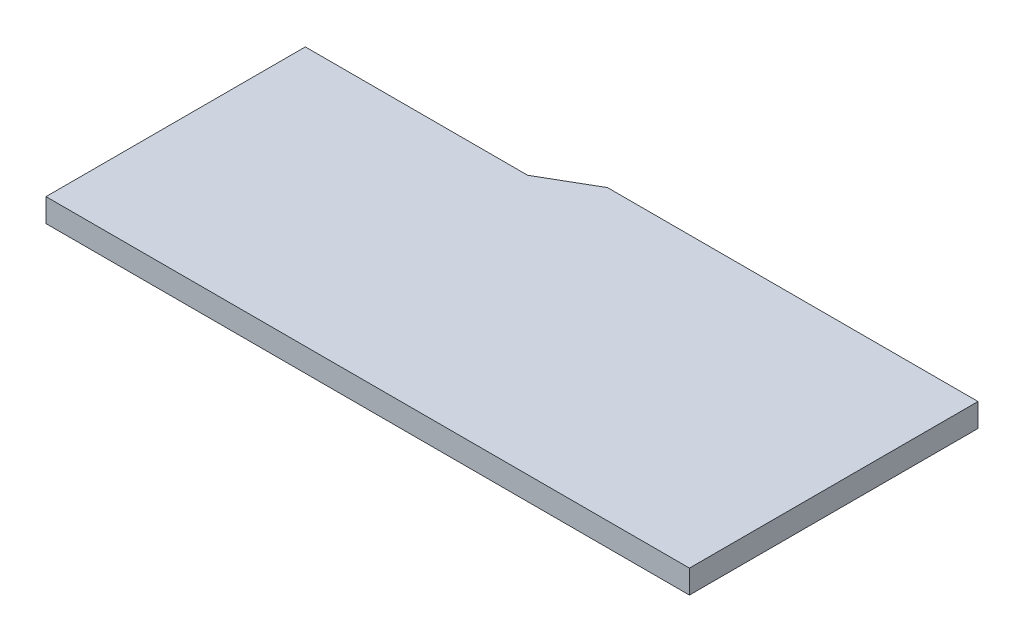
ISO-10303-21;
HEADER;
FILE_DESCRIPTION(('STEP AP214'),'2;1');
FILE_NAME('part.step','',(''),(''),'','','');
FILE_SCHEMA(('AUTOMOTIVE_DESIGN { 1 0 10303 214 1 1 1 1 }'));
ENDSEC;
DATA;
#1=APPLICATION_CONTEXT('core data for automotive mechanical design processes');
#2=APPLICATION_PROTOCOL_DEFINITION('international standard','automotive_design',2000,#1);
#3=PRODUCT_CONTEXT('',#1,'mechanical');
#4=PRODUCT('Part','Part','',(#3));
#5=PRODUCT_RELATED_PRODUCT_CATEGORY('part','',(#4));
#6=PRODUCT_DEFINITION_FORMATION('','',#4);
#7=PRODUCT_DEFINITION_CONTEXT('part definition',#1,'design');
#8=PRODUCT_DEFINITION('design','',#6,#7);
#9=PRODUCT_DEFINITION_SHAPE('','',#8);
#10=(LENGTH_UNIT() NAMED_UNIT(*) SI_UNIT(.MILLI.,.METRE.));
#11=(NAMED_UNIT(*) PLANE_ANGLE_UNIT() SI_UNIT($,.RADIAN.));
#12=(NAMED_UNIT(*) SI_UNIT($,.STERADIAN.) SOLID_ANGLE_UNIT());
#13=UNCERTAINTY_MEASURE_WITH_UNIT(LENGTH_MEASURE(1.E-05),#10,'distance_accuracy_value','');
#14=(GEOMETRIC_REPRESENTATION_CONTEXT(3) GLOBAL_UNCERTAINTY_ASSIGNED_CONTEXT((#13)) GLOBAL_UNIT_ASSIGNED_CONTEXT((#10,
#11,#12)) REPRESENTATION_CONTEXT('',''));
#15=CARTESIAN_POINT('',(0.,0.,0.));
#16=DIRECTION('',(0.,0.,1.));
#17=DIRECTION('',(1.,0.,0.));
#18=AXIS2_PLACEMENT_3D('',#15,#16,#17);
#19=CARTESIAN_POINT('',(-50.9807621135329,12.,-133.));
#20=DIRECTION('',(0.,0.,1.));
#21=DIRECTION('',(1.,0.,0.));
#22=AXIS2_PLACEMENT_3D('',#19,#20,#21);
#23=PLANE('',#22);
#24=DIRECTION('',(-1.,0.,0.));
#25=VECTOR('',#24,1.);
#26=CARTESIAN_POINT('',(-50.9807621135329,0.,-133.));
#27=LINE('',#26,#25);
#28=CARTESIAN_POINT('',(-50.9807621135329,0.,-133.));
#29=VERTEX_POINT('',#28);
#30=CARTESIAN_POINT('',(-165.,0.,-133.));
#31=VERTEX_POINT('',#30);
#32=EDGE_CURVE('E117',#29,#31,#27,.T.);
#33=ORIENTED_EDGE('',*,*,#32,.T.);
#34=DIRECTION('',(0.,-1.,0.));
#35=VECTOR('',#34,1.);
#36=CARTESIAN_POINT('',(-165.,12.,-133.));
#37=LINE('',#36,#35);
#38=CARTESIAN_POINT('',(-165.,12.,-133.));
#39=VERTEX_POINT('',#38);
#40=EDGE_CURVE('E11',#39,#31,#37,.T.);
#41=ORIENTED_EDGE('',*,*,#40,.F.);
#42=DIRECTION('',(-1.,0.,0.));
#43=VECTOR('',#42,1.);
#44=CARTESIAN_POINT('',(-50.9807621135329,12.,-133.));
#45=LINE('',#44,#43);
#46=CARTESIAN_POINT('',(-50.9807621135329,12.,-133.));
#47=VERTEX_POINT('',#46);
#48=EDGE_CURVE('E127',#47,#39,#45,.T.);
#49=ORIENTED_EDGE('',*,*,#48,.F.);
#50=DIRECTION('',(0.,-1.,0.));
#51=VECTOR('',#50,1.);
#52=CARTESIAN_POINT('',(-50.9807621135329,12.,-133.));
#53=LINE('',#52,#51);
#54=EDGE_CURVE('E113',#47,#29,#53,.T.);
#55=ORIENTED_EDGE('',*,*,#54,.T.);
#56=EDGE_LOOP('',(#33,#41,#49,#55));
#57=FACE_BOUND('',#56,.T.);
#58=ADVANCED_FACE('F33',(#57),#23,.F.);
#59=CARTESIAN_POINT('',(-165.,12.,-133.));
#60=DIRECTION('',(1.,0.,0.));
#61=DIRECTION('',(0.,0.,-1.));
#62=AXIS2_PLACEMENT_3D('',#59,#60,#61);
#63=PLANE('',#62);
#64=DIRECTION('',(0.,0.,1.));
#65=VECTOR('',#64,1.);
#66=CARTESIAN_POINT('',(-165.,0.,-133.));
#67=LINE('',#66,#65);
#68=CARTESIAN_POINT('',(-165.,0.,0.));
#69=VERTEX_POINT('',#68);
#70=EDGE_CURVE('E120',#31,#69,#67,.T.);
#71=ORIENTED_EDGE('',*,*,#70,.T.);
#72=DIRECTION('',(0.,-1.,0.));
#73=VECTOR('',#72,1.);
#74=CARTESIAN_POINT('',(-165.,12.,0.));
#75=LINE('',#74,#73);
#76=CARTESIAN_POINT('',(-165.,12.,0.));
#77=VERTEX_POINT('',#76);
#78=EDGE_CURVE('E41',#77,#69,#75,.T.);
#79=ORIENTED_EDGE('',*,*,#78,.F.);
#80=DIRECTION('',(0.,0.,1.));
#81=VECTOR('',#80,1.);
#82=CARTESIAN_POINT('',(-165.,12.,-133.));
#83=LINE('',#82,#81);
#84=EDGE_CURVE('E86',#39,#77,#83,.T.);
#85=ORIENTED_EDGE('',*,*,#84,.F.);
#86=ORIENTED_EDGE('',*,*,#40,.T.);
#87=EDGE_LOOP('',(#71,#79,#85,#86));
#88=FACE_BOUND('',#87,.T.);
#89=ADVANCED_FACE('F151',(#88),#63,.F.);
#90=CARTESIAN_POINT('',(-165.,12.,0.));
#91=DIRECTION('',(0.,0.,-1.));
#92=DIRECTION('',(-1.,0.,0.));
#93=AXIS2_PLACEMENT_3D('',#90,#91,#92);
#94=PLANE('',#93);
#95=DIRECTION('',(1.,0.,0.));
#96=VECTOR('',#95,1.);
#97=CARTESIAN_POINT('',(-165.,0.,0.));
#98=LINE('',#97,#96);
#99=CARTESIAN_POINT('',(165.,0.,0.));
#100=VERTEX_POINT('',#99);
#101=EDGE_CURVE('E122',#69,#100,#98,.T.);
#102=ORIENTED_EDGE('',*,*,#101,.T.);
#103=DIRECTION('',(0.,-1.,0.));
#104=VECTOR('',#103,1.);
#105=CARTESIAN_POINT('',(165.,12.,0.));
#106=LINE('',#105,#104);
#107=CARTESIAN_POINT('',(165.,12.,0.));
#108=VERTEX_POINT('',#107);
#109=EDGE_CURVE('E108',#108,#100,#106,.T.);
#110=ORIENTED_EDGE('',*,*,#109,.F.);
#111=DIRECTION('',(1.,0.,0.));
#112=VECTOR('',#111,1.);
#113=CARTESIAN_POINT('',(-165.,12.,0.));
#114=LINE('',#113,#112);
#115=EDGE_CURVE('E99',#77,#108,#114,.T.);
#116=ORIENTED_EDGE('',*,*,#115,.F.);
#117=ORIENTED_EDGE('',*,*,#78,.T.);
#118=EDGE_LOOP('',(#102,#110,#116,#117));
#119=FACE_BOUND('',#118,.T.);
#120=ADVANCED_FACE('F133',(#119),#94,.F.);
#121=CARTESIAN_POINT('',(165.,12.,0.));
#122=DIRECTION('',(-1.,0.,0.));
#123=DIRECTION('',(0.,0.,1.));
#124=AXIS2_PLACEMENT_3D('',#121,#122,#123);
#125=PLANE('',#124);
#126=DIRECTION('',(0.,0.,-1.));
#127=VECTOR('',#126,1.);
#128=CARTESIAN_POINT('',(165.,0.,0.));
#129=LINE('',#128,#127);
#130=CARTESIAN_POINT('',(165.,0.,-148.));
#131=VERTEX_POINT('',#130);
#132=EDGE_CURVE('E107',#100,#131,#129,.T.);
#133=ORIENTED_EDGE('',*,*,#132,.T.);
#134=DIRECTION('',(0.,-1.,0.));
#135=VECTOR('',#134,1.);
#136=CARTESIAN_POINT('',(165.,12.,-148.));
#137=LINE('',#136,#135);
#138=CARTESIAN_POINT('',(165.,12.,-148.));
#139=VERTEX_POINT('',#138);
#140=EDGE_CURVE('E104',#139,#131,#137,.T.);
#141=ORIENTED_EDGE('',*,*,#140,.F.);
#142=DIRECTION('',(0.,0.,-1.));
#143=VECTOR('',#142,1.);
#144=CARTESIAN_POINT('',(165.,12.,0.));
#145=LINE('',#144,#143);
#146=EDGE_CURVE('E93',#108,#139,#145,.T.);
#147=ORIENTED_EDGE('',*,*,#146,.F.);
#148=ORIENTED_EDGE('',*,*,#109,.T.);
#149=EDGE_LOOP('',(#133,#141,#147,#148));
#150=FACE_BOUND('',#149,.T.);
#151=ADVANCED_FACE('F105',(#150),#125,.F.);
#152=CARTESIAN_POINT('',(165.,12.,-148.));
#153=DIRECTION('',(0.,0.,1.));
#154=DIRECTION('',(1.,0.,0.));
#155=AXIS2_PLACEMENT_3D('',#152,#153,#154);
#156=PLANE('',#155);
#157=DIRECTION('',(-1.,0.,0.));
#158=VECTOR('',#157,1.);
#159=CARTESIAN_POINT('',(165.,0.,-148.));
#160=LINE('',#159,#158);
#161=CARTESIAN_POINT('',(-25.,0.,-148.));
#162=VERTEX_POINT('',#161);
#163=EDGE_CURVE('E72',#131,#162,#160,.T.);
#164=ORIENTED_EDGE('',*,*,#163,.T.);
#165=DIRECTION('',(0.,-1.,0.));
#166=VECTOR('',#165,1.);
#167=CARTESIAN_POINT('',(-25.,12.,-148.));
#168=LINE('',#167,#166);
#169=CARTESIAN_POINT('',(-25.,12.,-148.));
#170=VERTEX_POINT('',#169);
#171=EDGE_CURVE('E109',#170,#162,#168,.T.);
#172=ORIENTED_EDGE('',*,*,#171,.F.);
#173=DIRECTION('',(-1.,0.,0.));
#174=VECTOR('',#173,1.);
#175=CARTESIAN_POINT('',(165.,12.,-148.));
#176=LINE('',#175,#174);
#177=EDGE_CURVE('E97',#139,#170,#176,.T.);
#178=ORIENTED_EDGE('',*,*,#177,.F.);
#179=ORIENTED_EDGE('',*,*,#140,.T.);
#180=EDGE_LOOP('',(#164,#172,#178,#179));
#181=FACE_BOUND('',#180,.T.);
#182=ADVANCED_FACE('F111',(#181),#156,.F.);
#183=CARTESIAN_POINT('',(-25.,12.,-148.));
#184=DIRECTION('',(0.5,0.,0.866025403784439));
#185=DIRECTION('',(0.866025403784439,0.,-0.5));
#186=AXIS2_PLACEMENT_3D('',#183,#184,#185);
#187=PLANE('',#186);
#188=DIRECTION('',(-0.866025403784438,0.,0.5));
#189=VECTOR('',#188,1.);
#190=CARTESIAN_POINT('',(-25.,0.,-148.));
#191=LINE('',#190,#189);
#192=EDGE_CURVE('E78',#162,#29,#191,.T.);
#193=ORIENTED_EDGE('',*,*,#192,.T.);
#194=ORIENTED_EDGE('',*,*,#54,.F.);
#195=DIRECTION('',(-0.866025403784438,0.,0.5));
#196=VECTOR('',#195,1.);
#197=CARTESIAN_POINT('',(-25.,12.,-148.));
#198=LINE('',#197,#196);
#199=EDGE_CURVE('E49',#170,#47,#198,.T.);
#200=ORIENTED_EDGE('',*,*,#199,.F.);
#201=ORIENTED_EDGE('',*,*,#171,.T.);
#202=EDGE_LOOP('',(#193,#194,#200,#201));
#203=FACE_BOUND('',#202,.T.);
#204=ADVANCED_FACE('F140',(#203),#187,.F.);
#205=CARTESIAN_POINT('',(0.,12.,0.));
#206=DIRECTION('',(0.,1.,0.));
#207=DIRECTION('',(0.,0.,1.));
#208=AXIS2_PLACEMENT_3D('',#205,#206,#207);
#209=PLANE('',#208);
#210=ORIENTED_EDGE('',*,*,#48,.T.);
#211=ORIENTED_EDGE('',*,*,#84,.T.);
#212=ORIENTED_EDGE('',*,*,#115,.T.);
#213=ORIENTED_EDGE('',*,*,#146,.T.);
#214=ORIENTED_EDGE('',*,*,#177,.T.);
#215=ORIENTED_EDGE('',*,*,#199,.T.);
#216=EDGE_LOOP('',(#210,#211,#212,#213,#214,#215));
#217=FACE_BOUND('',#216,.T.);
#218=ADVANCED_FACE('F95',(#217),#209,.T.);
#219=CARTESIAN_POINT('',(0.,0.,0.));
#220=DIRECTION('',(0.,1.,0.));
#221=DIRECTION('',(0.,0.,1.));
#222=AXIS2_PLACEMENT_3D('',#219,#220,#221);
#223=PLANE('',#222);
#224=ORIENTED_EDGE('',*,*,#32,.F.);
#225=ORIENTED_EDGE('',*,*,#192,.F.);
#226=ORIENTED_EDGE('',*,*,#163,.F.);
#227=ORIENTED_EDGE('',*,*,#132,.F.);
#228=ORIENTED_EDGE('',*,*,#101,.F.);
#229=ORIENTED_EDGE('',*,*,#70,.F.);
#230=EDGE_LOOP('',(#224,#225,#226,#227,#228,#229));
#231=FACE_BOUND('',#230,.T.);
#232=ADVANCED_FACE('F136',(#231),#223,.F.);
#233=CLOSED_SHELL('',(#58,#89,#120,#151,#182,#204,#218,#232));
#234=MANIFOLD_SOLID_BREP('B2',#233);
#235=ADVANCED_BREP_SHAPE_REPRESENTATION('',(#18,#234),#14);
#236=SHAPE_DEFINITION_REPRESENTATION(#9,#235);
ENDSEC;
END-ISO-10303-21;
